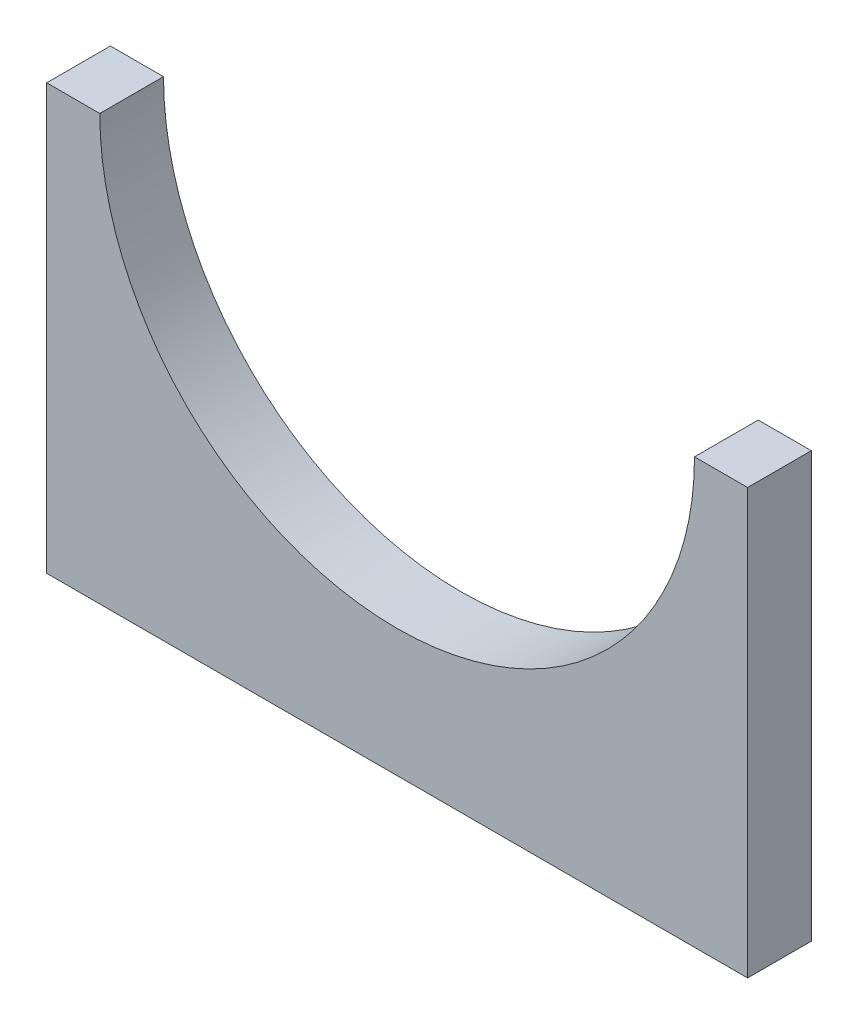
ISO-10303-21;
HEADER;
FILE_DESCRIPTION(('STEP AP214'),'2;1');
FILE_NAME('part.step','',(''),(''),'','','');
FILE_SCHEMA(('AUTOMOTIVE_DESIGN { 1 0 10303 214 1 1 1 1 }'));
ENDSEC;
DATA;
#1=APPLICATION_CONTEXT('core data for automotive mechanical design processes');
#2=APPLICATION_PROTOCOL_DEFINITION('international standard','automotive_design',2000,#1);
#3=PRODUCT_CONTEXT('',#1,'mechanical');
#4=PRODUCT('Part','Part','',(#3));
#5=PRODUCT_RELATED_PRODUCT_CATEGORY('part','',(#4));
#6=PRODUCT_DEFINITION_FORMATION('','',#4);
#7=PRODUCT_DEFINITION_CONTEXT('part definition',#1,'design');
#8=PRODUCT_DEFINITION('design','',#6,#7);
#9=PRODUCT_DEFINITION_SHAPE('','',#8);
#10=(LENGTH_UNIT() NAMED_UNIT(*) SI_UNIT(.MILLI.,.METRE.));
#11=(NAMED_UNIT(*) PLANE_ANGLE_UNIT() SI_UNIT($,.RADIAN.));
#12=(NAMED_UNIT(*) SI_UNIT($,.STERADIAN.) SOLID_ANGLE_UNIT());
#13=UNCERTAINTY_MEASURE_WITH_UNIT(LENGTH_MEASURE(1.E-05),#10,'distance_accuracy_value','');
#14=(GEOMETRIC_REPRESENTATION_CONTEXT(3) GLOBAL_UNCERTAINTY_ASSIGNED_CONTEXT((#13)) GLOBAL_UNIT_ASSIGNED_CONTEXT((#10,
#11,#12)) REPRESENTATION_CONTEXT('',''));
#15=CARTESIAN_POINT('',(0.,0.,0.));
#16=DIRECTION('',(0.,0.,1.));
#17=DIRECTION('',(1.,0.,0.));
#18=AXIS2_PLACEMENT_3D('',#15,#16,#17);
#19=CARTESIAN_POINT('',(0.,0.,1.5));
#20=DIRECTION('',(0.,0.,-1.));
#21=DIRECTION('',(-1.,0.,0.));
#22=AXIS2_PLACEMENT_3D('',#19,#20,#21);
#23=CYLINDRICAL_SURFACE('',#22,14.);
#24=CARTESIAN_POINT('',(0.,0.,-1.5));
#25=DIRECTION('',(0.,0.,-1.));
#26=DIRECTION('',(1.,0.,0.));
#27=AXIS2_PLACEMENT_3D('',#24,#25,#26);
#28=CIRCLE('',#27,14.);
#29=CARTESIAN_POINT('',(14.,0.,-1.5));
#30=VERTEX_POINT('',#29);
#31=CARTESIAN_POINT('',(-14.,0.,-1.5));
#32=VERTEX_POINT('',#31);
#33=EDGE_CURVE('E117',#30,#32,#28,.T.);
#34=ORIENTED_EDGE('',*,*,#33,.T.);
#35=DIRECTION('',(0.,0.,-1.));
#36=VECTOR('',#35,1.);
#37=CARTESIAN_POINT('',(-14.,0.,1.5));
#38=LINE('',#37,#36);
#39=CARTESIAN_POINT('',(-14.,0.,1.5));
#40=VERTEX_POINT('',#39);
#41=EDGE_CURVE('E11',#40,#32,#38,.T.);
#42=ORIENTED_EDGE('',*,*,#41,.F.);
#43=CARTESIAN_POINT('',(0.,0.,1.5));
#44=DIRECTION('',(0.,0.,-1.));
#45=DIRECTION('',(1.,0.,0.));
#46=AXIS2_PLACEMENT_3D('',#43,#44,#45);
#47=CIRCLE('',#46,14.);
#48=CARTESIAN_POINT('',(14.,0.,1.5));
#49=VERTEX_POINT('',#48);
#50=EDGE_CURVE('E127',#49,#40,#47,.T.);
#51=ORIENTED_EDGE('',*,*,#50,.F.);
#52=DIRECTION('',(0.,0.,-1.));
#53=VECTOR('',#52,1.);
#54=CARTESIAN_POINT('',(14.,0.,1.5));
#55=LINE('',#54,#53);
#56=EDGE_CURVE('E113',#49,#30,#55,.T.);
#57=ORIENTED_EDGE('',*,*,#56,.T.);
#58=EDGE_LOOP('',(#34,#42,#51,#57));
#59=FACE_BOUND('',#58,.T.);
#60=ADVANCED_FACE('F33',(#59),#23,.F.);
#61=CARTESIAN_POINT('',(-16.5,0.,1.5));
#62=DIRECTION('',(0.,-1.,0.));
#63=DIRECTION('',(0.,0.,-1.));
#64=AXIS2_PLACEMENT_3D('',#61,#62,#63);
#65=PLANE('',#64);
#66=DIRECTION('',(-1.,0.,0.));
#67=VECTOR('',#66,1.);
#68=CARTESIAN_POINT('',(-16.5,0.,-1.5));
#69=LINE('',#68,#67);
#70=CARTESIAN_POINT('',(-16.5,0.,-1.5));
#71=VERTEX_POINT('',#70);
#72=EDGE_CURVE('E120',#32,#71,#69,.T.);
#73=ORIENTED_EDGE('',*,*,#72,.T.);
#74=DIRECTION('',(0.,0.,-1.));
#75=VECTOR('',#74,1.);
#76=CARTESIAN_POINT('',(-16.5,0.,1.5));
#77=LINE('',#76,#75);
#78=CARTESIAN_POINT('',(-16.5,0.,1.5));
#79=VERTEX_POINT('',#78);
#80=EDGE_CURVE('E41',#79,#71,#77,.T.);
#81=ORIENTED_EDGE('',*,*,#80,.F.);
#82=DIRECTION('',(-1.,0.,0.));
#83=VECTOR('',#82,1.);
#84=CARTESIAN_POINT('',(-16.5,0.,1.5));
#85=LINE('',#84,#83);
#86=EDGE_CURVE('E86',#40,#79,#85,.T.);
#87=ORIENTED_EDGE('',*,*,#86,.F.);
#88=ORIENTED_EDGE('',*,*,#41,.T.);
#89=EDGE_LOOP('',(#73,#81,#87,#88));
#90=FACE_BOUND('',#89,.T.);
#91=ADVANCED_FACE('F151',(#90),#65,.F.);
#92=CARTESIAN_POINT('',(-16.5,-20.,1.5));
#93=DIRECTION('',(1.,0.,0.));
#94=DIRECTION('',(0.,1.,0.));
#95=AXIS2_PLACEMENT_3D('',#92,#93,#94);
#96=PLANE('',#95);
#97=DIRECTION('',(0.,-1.,0.));
#98=VECTOR('',#97,1.);
#99=CARTESIAN_POINT('',(-16.5,-20.,-1.5));
#100=LINE('',#99,#98);
#101=CARTESIAN_POINT('',(-16.5,-20.,-1.5));
#102=VERTEX_POINT('',#101);
#103=EDGE_CURVE('E122',#71,#102,#100,.T.);
#104=ORIENTED_EDGE('',*,*,#103,.T.);
#105=DIRECTION('',(0.,0.,-1.));
#106=VECTOR('',#105,1.);
#107=CARTESIAN_POINT('',(-16.5,-20.,1.5));
#108=LINE('',#107,#106);
#109=CARTESIAN_POINT('',(-16.5,-20.,1.5));
#110=VERTEX_POINT('',#109);
#111=EDGE_CURVE('E108',#110,#102,#108,.T.);
#112=ORIENTED_EDGE('',*,*,#111,.F.);
#113=DIRECTION('',(0.,-1.,0.));
#114=VECTOR('',#113,1.);
#115=CARTESIAN_POINT('',(-16.5,-20.,1.5));
#116=LINE('',#115,#114);
#117=EDGE_CURVE('E99',#79,#110,#116,.T.);
#118=ORIENTED_EDGE('',*,*,#117,.F.);
#119=ORIENTED_EDGE('',*,*,#80,.T.);
#120=EDGE_LOOP('',(#104,#112,#118,#119));
#121=FACE_BOUND('',#120,.T.);
#122=ADVANCED_FACE('F133',(#121),#96,.F.);
#123=CARTESIAN_POINT('',(16.5,-20.,1.5));
#124=DIRECTION('',(0.,1.,0.));
#125=DIRECTION('',(-1.,0.,0.));
#126=AXIS2_PLACEMENT_3D('',#123,#124,#125);
#127=PLANE('',#126);
#128=DIRECTION('',(1.,0.,0.));
#129=VECTOR('',#128,1.);
#130=CARTESIAN_POINT('',(16.5,-20.,-1.5));
#131=LINE('',#130,#129);
#132=CARTESIAN_POINT('',(16.5,-20.,-1.5));
#133=VERTEX_POINT('',#132);
#134=EDGE_CURVE('E107',#102,#133,#131,.T.);
#135=ORIENTED_EDGE('',*,*,#134,.T.);
#136=DIRECTION('',(0.,0.,-1.));
#137=VECTOR('',#136,1.);
#138=CARTESIAN_POINT('',(16.5,-20.,1.5));
#139=LINE('',#138,#137);
#140=CARTESIAN_POINT('',(16.5,-20.,1.5));
#141=VERTEX_POINT('',#140);
#142=EDGE_CURVE('E104',#141,#133,#139,.T.);
#143=ORIENTED_EDGE('',*,*,#142,.F.);
#144=DIRECTION('',(1.,0.,0.));
#145=VECTOR('',#144,1.);
#146=CARTESIAN_POINT('',(16.5,-20.,1.5));
#147=LINE('',#146,#145);
#148=EDGE_CURVE('E93',#110,#141,#147,.T.);
#149=ORIENTED_EDGE('',*,*,#148,.F.);
#150=ORIENTED_EDGE('',*,*,#111,.T.);
#151=EDGE_LOOP('',(#135,#143,#149,#150));
#152=FACE_BOUND('',#151,.T.);
#153=ADVANCED_FACE('F105',(#152),#127,.F.);
#154=CARTESIAN_POINT('',(16.5,0.,1.5));
#155=DIRECTION('',(-1.,0.,0.));
#156=DIRECTION('',(0.,-1.,0.));
#157=AXIS2_PLACEMENT_3D('',#154,#155,#156);
#158=PLANE('',#157);
#159=DIRECTION('',(0.,1.,0.));
#160=VECTOR('',#159,1.);
#161=CARTESIAN_POINT('',(16.5,0.,-1.5));
#162=LINE('',#161,#160);
#163=CARTESIAN_POINT('',(16.5,0.,-1.5));
#164=VERTEX_POINT('',#163);
#165=EDGE_CURVE('E72',#133,#164,#162,.T.);
#166=ORIENTED_EDGE('',*,*,#165,.T.);
#167=DIRECTION('',(0.,0.,-1.));
#168=VECTOR('',#167,1.);
#169=CARTESIAN_POINT('',(16.5,0.,1.5));
#170=LINE('',#169,#168);
#171=CARTESIAN_POINT('',(16.5,0.,1.5));
#172=VERTEX_POINT('',#171);
#173=EDGE_CURVE('E109',#172,#164,#170,.T.);
#174=ORIENTED_EDGE('',*,*,#173,.F.);
#175=DIRECTION('',(0.,1.,0.));
#176=VECTOR('',#175,1.);
#177=CARTESIAN_POINT('',(16.5,0.,1.5));
#178=LINE('',#177,#176);
#179=EDGE_CURVE('E97',#141,#172,#178,.T.);
#180=ORIENTED_EDGE('',*,*,#179,.F.);
#181=ORIENTED_EDGE('',*,*,#142,.T.);
#182=EDGE_LOOP('',(#166,#174,#180,#181));
#183=FACE_BOUND('',#182,.T.);
#184=ADVANCED_FACE('F111',(#183),#158,.F.);
#185=CARTESIAN_POINT('',(14.,0.,1.5));
#186=DIRECTION('',(0.,-1.,0.));
#187=DIRECTION('',(1.,0.,0.));
#188=AXIS2_PLACEMENT_3D('',#185,#186,#187);
#189=PLANE('',#188);
#190=DIRECTION('',(-1.,0.,0.));
#191=VECTOR('',#190,1.);
#192=CARTESIAN_POINT('',(14.,0.,-1.5));
#193=LINE('',#192,#191);
#194=EDGE_CURVE('E78',#164,#30,#193,.T.);
#195=ORIENTED_EDGE('',*,*,#194,.T.);
#196=ORIENTED_EDGE('',*,*,#56,.F.);
#197=DIRECTION('',(-1.,0.,0.));
#198=VECTOR('',#197,1.);
#199=CARTESIAN_POINT('',(14.,0.,1.5));
#200=LINE('',#199,#198);
#201=EDGE_CURVE('E49',#172,#49,#200,.T.);
#202=ORIENTED_EDGE('',*,*,#201,.F.);
#203=ORIENTED_EDGE('',*,*,#173,.T.);
#204=EDGE_LOOP('',(#195,#196,#202,#203));
#205=FACE_BOUND('',#204,.T.);
#206=ADVANCED_FACE('F140',(#205),#189,.F.);
#207=CARTESIAN_POINT('',(0.,0.,1.5));
#208=DIRECTION('',(0.,0.,1.));
#209=DIRECTION('',(1.,0.,0.));
#210=AXIS2_PLACEMENT_3D('',#207,#208,#209);
#211=PLANE('',#210);
#212=ORIENTED_EDGE('',*,*,#50,.T.);
#213=ORIENTED_EDGE('',*,*,#86,.T.);
#214=ORIENTED_EDGE('',*,*,#117,.T.);
#215=ORIENTED_EDGE('',*,*,#148,.T.);
#216=ORIENTED_EDGE('',*,*,#179,.T.);
#217=ORIENTED_EDGE('',*,*,#201,.T.);
#218=EDGE_LOOP('',(#212,#213,#214,#215,#216,#217));
#219=FACE_BOUND('',#218,.T.);
#220=ADVANCED_FACE('F95',(#219),#211,.T.);
#221=CARTESIAN_POINT('',(0.,0.,-1.5));
#222=DIRECTION('',(0.,0.,1.));
#223=DIRECTION('',(1.,0.,0.));
#224=AXIS2_PLACEMENT_3D('',#221,#222,#223);
#225=PLANE('',#224);
#226=ORIENTED_EDGE('',*,*,#33,.F.);
#227=ORIENTED_EDGE('',*,*,#194,.F.);
#228=ORIENTED_EDGE('',*,*,#165,.F.);
#229=ORIENTED_EDGE('',*,*,#134,.F.);
#230=ORIENTED_EDGE('',*,*,#103,.F.);
#231=ORIENTED_EDGE('',*,*,#72,.F.);
#232=EDGE_LOOP('',(#226,#227,#228,#229,#230,#231));
#233=FACE_BOUND('',#232,.T.);
#234=ADVANCED_FACE('F136',(#233),#225,.F.);
#235=CLOSED_SHELL('',(#60,#91,#122,#153,#184,#206,#220,#234));
#236=MANIFOLD_SOLID_BREP('B2',#235);
#237=ADVANCED_BREP_SHAPE_REPRESENTATION('',(#18,#236),#14);
#238=SHAPE_DEFINITION_REPRESENTATION(#9,#237);
ENDSEC;
END-ISO-10303-21;
